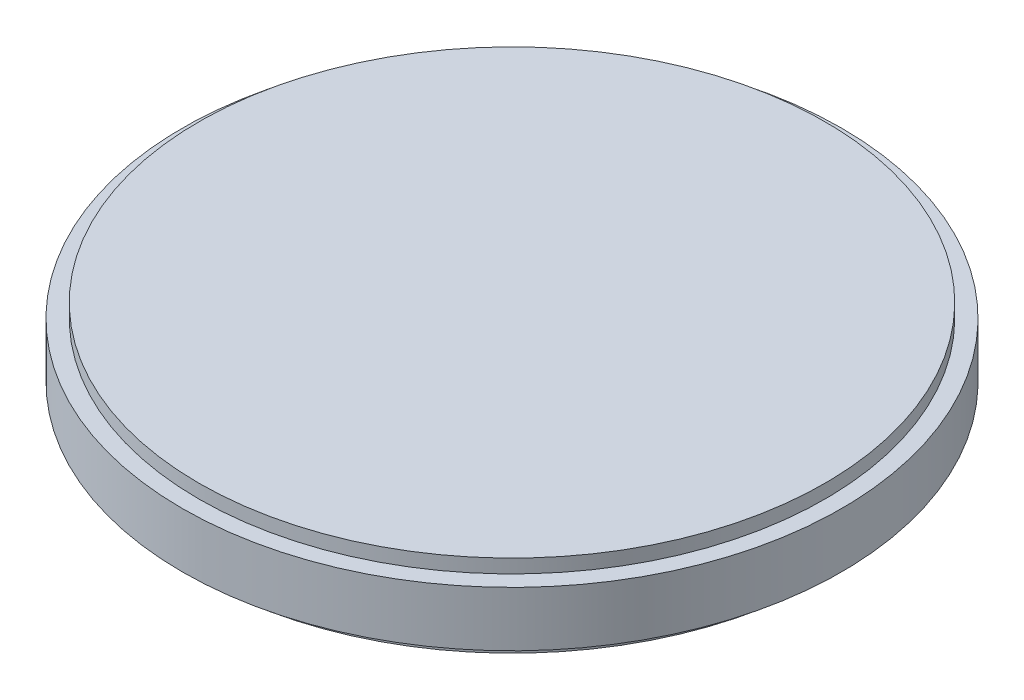
ISO-10303-21;
HEADER;
FILE_DESCRIPTION(('STEP AP214'),'2;1');
FILE_NAME('part.step','',(''),(''),'','','');
FILE_SCHEMA(('AUTOMOTIVE_DESIGN { 1 0 10303 214 1 1 1 1 }'));
ENDSEC;
DATA;
#1=APPLICATION_CONTEXT('core data for automotive mechanical design processes');
#2=APPLICATION_PROTOCOL_DEFINITION('international standard','automotive_design',2000,#1);
#3=PRODUCT_CONTEXT('',#1,'mechanical');
#4=PRODUCT('Part','Part','',(#3));
#5=PRODUCT_RELATED_PRODUCT_CATEGORY('part','',(#4));
#6=PRODUCT_DEFINITION_FORMATION('','',#4);
#7=PRODUCT_DEFINITION_CONTEXT('part definition',#1,'design');
#8=PRODUCT_DEFINITION('design','',#6,#7);
#9=PRODUCT_DEFINITION_SHAPE('','',#8);
#10=(LENGTH_UNIT() NAMED_UNIT(*) SI_UNIT(.MILLI.,.METRE.));
#11=(NAMED_UNIT(*) PLANE_ANGLE_UNIT() SI_UNIT($,.RADIAN.));
#12=(NAMED_UNIT(*) SI_UNIT($,.STERADIAN.) SOLID_ANGLE_UNIT());
#13=UNCERTAINTY_MEASURE_WITH_UNIT(LENGTH_MEASURE(1.E-05),#10,'distance_accuracy_value','');
#14=(GEOMETRIC_REPRESENTATION_CONTEXT(3) GLOBAL_UNCERTAINTY_ASSIGNED_CONTEXT((#13)) GLOBAL_UNIT_ASSIGNED_CONTEXT((#10,
#11,#12)) REPRESENTATION_CONTEXT('',''));
#15=CARTESIAN_POINT('',(0.,0.,0.));
#16=DIRECTION('',(0.,0.,1.));
#17=DIRECTION('',(1.,0.,0.));
#18=AXIS2_PLACEMENT_3D('',#15,#16,#17);
#19=CARTESIAN_POINT('',(0.,7.5,0.));
#20=DIRECTION('',(0.,-1.,0.));
#21=DIRECTION('',(0.,0.,-1.));
#22=AXIS2_PLACEMENT_3D('',#19,#20,#21);
#23=CYLINDRICAL_SURFACE('',#22,57.);
#24=CARTESIAN_POINT('',(0.,5.,0.));
#25=DIRECTION('',(0.,1.,0.));
#26=DIRECTION('',(0.,0.,1.));
#27=AXIS2_PLACEMENT_3D('',#24,#25,#26);
#28=CIRCLE('',#27,57.);
#29=CARTESIAN_POINT('',(0.,5.,57.));
#30=VERTEX_POINT('',#29);
#31=EDGE_CURVE('E50',#30,#30,#28,.T.);
#32=ORIENTED_EDGE('',*,*,#31,.T.);
#33=EDGE_LOOP('',(#32));
#34=FACE_BOUND('',#33,.T.);
#35=CARTESIAN_POINT('',(0.,7.5,0.));
#36=DIRECTION('',(0.,1.,0.));
#37=DIRECTION('',(0.,0.,1.));
#38=AXIS2_PLACEMENT_3D('',#35,#36,#37);
#39=CIRCLE('',#38,57.);
#40=CARTESIAN_POINT('',(0.,7.5,57.));
#41=VERTEX_POINT('',#40);
#42=EDGE_CURVE('E36',#41,#41,#39,.T.);
#43=ORIENTED_EDGE('',*,*,#42,.F.);
#44=EDGE_LOOP('',(#43));
#45=FACE_BOUND('',#44,.T.);
#46=ADVANCED_FACE('F30',(#34,#45),#23,.T.);
#47=CARTESIAN_POINT('',(0.,7.5,0.));
#48=DIRECTION('',(0.,1.,0.));
#49=DIRECTION('',(0.,0.,1.));
#50=AXIS2_PLACEMENT_3D('',#47,#48,#49);
#51=PLANE('',#50);
#52=ORIENTED_EDGE('',*,*,#42,.T.);
#53=EDGE_LOOP('',(#52));
#54=FACE_BOUND('',#53,.T.);
#55=ADVANCED_FACE('F61',(#54),#51,.T.);
#56=CARTESIAN_POINT('',(0.,5.,0.));
#57=DIRECTION('',(0.,1.,0.));
#58=DIRECTION('',(0.,0.,1.));
#59=AXIS2_PLACEMENT_3D('',#56,#57,#58);
#60=PLANE('',#59);
#61=CARTESIAN_POINT('',(0.,5.,0.));
#62=DIRECTION('',(0.,1.,0.));
#63=DIRECTION('',(0.,0.,1.));
#64=AXIS2_PLACEMENT_3D('',#61,#62,#63);
#65=CIRCLE('',#64,60.);
#66=CARTESIAN_POINT('',(0.,5.,60.));
#67=VERTEX_POINT('',#66);
#68=EDGE_CURVE('E45',#67,#67,#65,.T.);
#69=ORIENTED_EDGE('',*,*,#68,.T.);
#70=EDGE_LOOP('',(#69));
#71=FACE_BOUND('',#70,.T.);
#72=ORIENTED_EDGE('',*,*,#31,.F.);
#73=EDGE_LOOP('',(#72));
#74=FACE_BOUND('',#73,.T.);
#75=ADVANCED_FACE('F58',(#71,#74),#60,.T.);
#76=CARTESIAN_POINT('',(0.,-5.,0.));
#77=DIRECTION('',(0.,1.,0.));
#78=DIRECTION('',(0.,0.,1.));
#79=AXIS2_PLACEMENT_3D('',#76,#77,#78);
#80=PLANE('',#79);
#81=CARTESIAN_POINT('',(0.,-5.,0.));
#82=DIRECTION('',(0.,1.,0.));
#83=DIRECTION('',(0.,0.,1.));
#84=AXIS2_PLACEMENT_3D('',#81,#82,#83);
#85=CIRCLE('',#84,60.);
#86=CARTESIAN_POINT('',(0.,-5.,60.));
#87=VERTEX_POINT('',#86);
#88=EDGE_CURVE('E47',#87,#87,#85,.T.);
#89=ORIENTED_EDGE('',*,*,#88,.F.);
#90=EDGE_LOOP('',(#89));
#91=FACE_BOUND('',#90,.T.);
#92=CARTESIAN_POINT('',(0.,-5.,0.));
#93=DIRECTION('',(0.,1.,0.));
#94=DIRECTION('',(0.,0.,1.));
#95=AXIS2_PLACEMENT_3D('',#92,#93,#94);
#96=CIRCLE('',#95,57.);
#97=CARTESIAN_POINT('',(0.,-5.,57.));
#98=VERTEX_POINT('',#97);
#99=EDGE_CURVE('E10',#98,#98,#96,.T.);
#100=ORIENTED_EDGE('',*,*,#99,.T.);
#101=EDGE_LOOP('',(#100));
#102=FACE_BOUND('',#101,.T.);
#103=ADVANCED_FACE('F60',(#91,#102),#80,.F.);
#104=CARTESIAN_POINT('',(0.,5.,0.));
#105=DIRECTION('',(0.,-1.,0.));
#106=DIRECTION('',(0.,0.,-1.));
#107=AXIS2_PLACEMENT_3D('',#104,#105,#106);
#108=CYLINDRICAL_SURFACE('',#107,60.);
#109=ORIENTED_EDGE('',*,*,#68,.F.);
#110=EDGE_LOOP('',(#109));
#111=FACE_BOUND('',#110,.T.);
#112=ORIENTED_EDGE('',*,*,#88,.T.);
#113=EDGE_LOOP('',(#112));
#114=FACE_BOUND('',#113,.T.);
#115=ADVANCED_FACE('F68',(#111,#114),#108,.T.);
#116=CARTESIAN_POINT('',(0.,-7.5,0.));
#117=DIRECTION('',(0.,1.,0.));
#118=DIRECTION('',(0.,0.,1.));
#119=AXIS2_PLACEMENT_3D('',#116,#117,#118);
#120=PLANE('',#119);
#121=CARTESIAN_POINT('',(0.,-7.5,0.));
#122=DIRECTION('',(0.,1.,0.));
#123=DIRECTION('',(0.,0.,1.));
#124=AXIS2_PLACEMENT_3D('',#121,#122,#123);
#125=CIRCLE('',#124,57.);
#126=CARTESIAN_POINT('',(0.,-7.5,57.));
#127=VERTEX_POINT('',#126);
#128=EDGE_CURVE('E40',#127,#127,#125,.T.);
#129=ORIENTED_EDGE('',*,*,#128,.F.);
#130=EDGE_LOOP('',(#129));
#131=FACE_BOUND('',#130,.T.);
#132=ADVANCED_FACE('F77',(#131),#120,.F.);
#133=ORIENTED_EDGE('',*,*,#128,.T.);
#134=EDGE_LOOP('',(#133));
#135=FACE_BOUND('',#134,.T.);
#136=ORIENTED_EDGE('',*,*,#99,.F.);
#137=EDGE_LOOP('',(#136));
#138=FACE_BOUND('',#137,.T.);
#139=ADVANCED_FACE('F73',(#135,#138),#23,.T.);
#140=CLOSED_SHELL('',(#46,#55,#75,#103,#115,#132,#139));
#141=MANIFOLD_SOLID_BREP('B2',#140);
#142=ADVANCED_BREP_SHAPE_REPRESENTATION('',(#18,#141),#14);
#143=SHAPE_DEFINITION_REPRESENTATION(#9,#142);
ENDSEC;
END-ISO-10303-21;
